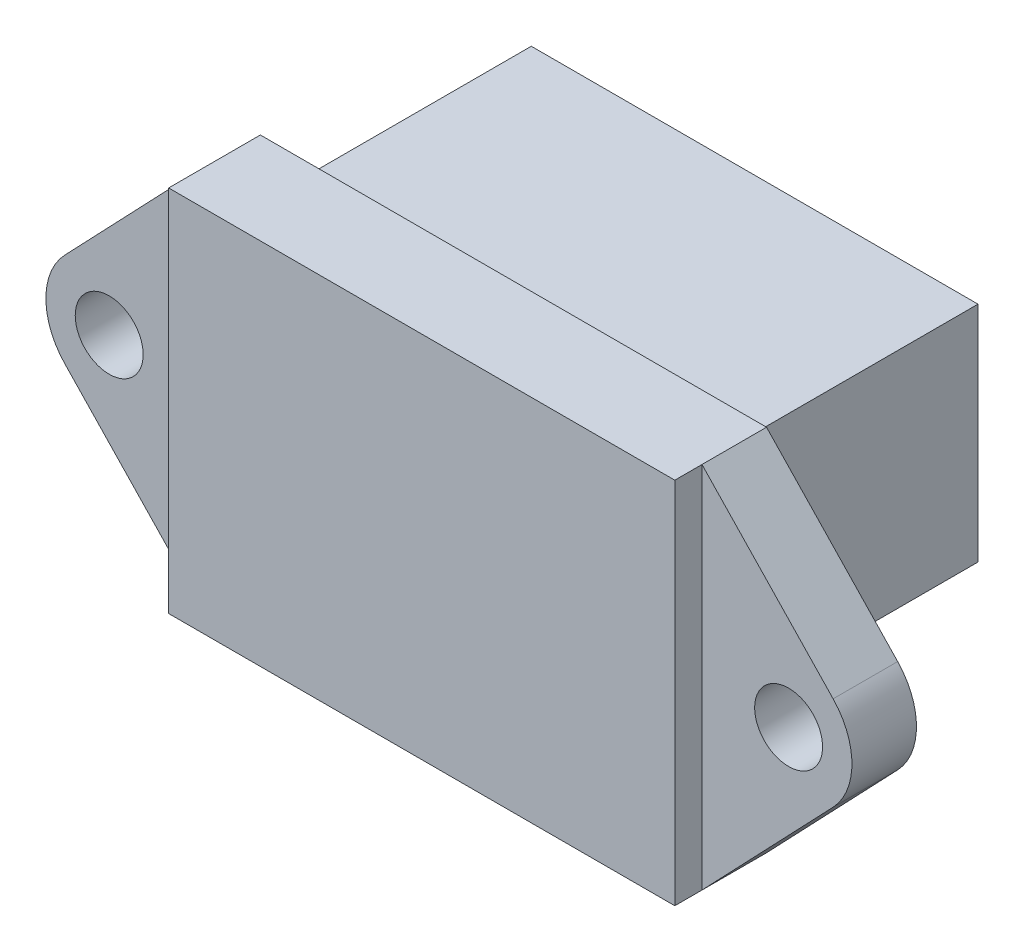
ISO-10303-21;
HEADER;
FILE_DESCRIPTION(('STEP AP214'),'2;1');
FILE_NAME('part.step','',(''),(''),'','','');
FILE_SCHEMA(('AUTOMOTIVE_DESIGN { 1 0 10303 214 1 1 1 1 }'));
ENDSEC;
DATA;
#1=APPLICATION_CONTEXT('core data for automotive mechanical design processes');
#2=APPLICATION_PROTOCOL_DEFINITION('international standard','automotive_design',2000,#1);
#3=PRODUCT_CONTEXT('',#1,'mechanical');
#4=PRODUCT('Part','Part','',(#3));
#5=PRODUCT_RELATED_PRODUCT_CATEGORY('part','',(#4));
#6=PRODUCT_DEFINITION_FORMATION('','',#4);
#7=PRODUCT_DEFINITION_CONTEXT('part definition',#1,'design');
#8=PRODUCT_DEFINITION('design','',#6,#7);
#9=PRODUCT_DEFINITION_SHAPE('','',#8);
#10=(LENGTH_UNIT() NAMED_UNIT(*) SI_UNIT(.MILLI.,.METRE.));
#11=(NAMED_UNIT(*) PLANE_ANGLE_UNIT() SI_UNIT($,.RADIAN.));
#12=(NAMED_UNIT(*) SI_UNIT($,.STERADIAN.) SOLID_ANGLE_UNIT());
#13=UNCERTAINTY_MEASURE_WITH_UNIT(LENGTH_MEASURE(1.E-05),#10,'distance_accuracy_value','');
#14=(GEOMETRIC_REPRESENTATION_CONTEXT(3) GLOBAL_UNCERTAINTY_ASSIGNED_CONTEXT((#13)) GLOBAL_UNIT_ASSIGNED_CONTEXT((#10,
#11,#12)) REPRESENTATION_CONTEXT('',''));
#15=CARTESIAN_POINT('',(0.,0.,0.));
#16=DIRECTION('',(0.,0.,1.));
#17=DIRECTION('',(1.,0.,0.));
#18=AXIS2_PLACEMENT_3D('',#15,#16,#17);
#19=CARTESIAN_POINT('',(-14.9,-10.85,5.4));
#20=DIRECTION('',(1.,0.,0.));
#21=DIRECTION('',(0.,0.,-1.));
#22=AXIS2_PLACEMENT_3D('',#19,#20,#21);
#23=PLANE('',#22);
#24=DIRECTION('',(0.,1.,0.));
#25=VECTOR('',#24,1.);
#26=CARTESIAN_POINT('',(-14.9,10.85,3.8));
#27=LINE('',#26,#25);
#28=CARTESIAN_POINT('',(-14.9,-10.85,3.8));
#29=VERTEX_POINT('',#28);
#30=CARTESIAN_POINT('',(-14.9,10.85,3.8));
#31=VERTEX_POINT('',#30);
#32=EDGE_CURVE('E198',#29,#31,#27,.T.);
#33=ORIENTED_EDGE('',*,*,#32,.F.);
#34=DIRECTION('',(0.,0.,-1.));
#35=VECTOR('',#34,1.);
#36=CARTESIAN_POINT('',(-14.9,-10.85,5.4));
#37=LINE('',#36,#35);
#38=CARTESIAN_POINT('',(-14.9,-10.85,5.4));
#39=VERTEX_POINT('',#38);
#40=EDGE_CURVE('E271',#39,#29,#37,.T.);
#41=ORIENTED_EDGE('',*,*,#40,.F.);
#42=DIRECTION('',(0.,-1.,0.));
#43=VECTOR('',#42,1.);
#44=CARTESIAN_POINT('',(-14.9,-10.85,5.4));
#45=LINE('',#44,#43);
#46=CARTESIAN_POINT('',(-14.9,10.85,5.4));
#47=VERTEX_POINT('',#46);
#48=EDGE_CURVE('E258',#47,#39,#45,.T.);
#49=ORIENTED_EDGE('',*,*,#48,.F.);
#50=DIRECTION('',(0.,0.,-1.));
#51=VECTOR('',#50,1.);
#52=CARTESIAN_POINT('',(-14.9,10.85,5.4));
#53=LINE('',#52,#51);
#54=EDGE_CURVE('E275',#47,#31,#53,.T.);
#55=ORIENTED_EDGE('',*,*,#54,.T.);
#56=EDGE_LOOP('',(#33,#41,#49,#55));
#57=FACE_BOUND('',#56,.T.);
#58=ADVANCED_FACE('F39',(#57),#23,.F.);
#59=CARTESIAN_POINT('',(14.9,-10.85,5.4));
#60=DIRECTION('',(-1.,0.,0.));
#61=DIRECTION('',(0.,0.,1.));
#62=AXIS2_PLACEMENT_3D('',#59,#60,#61);
#63=PLANE('',#62);
#64=DIRECTION('',(0.,-1.,0.));
#65=VECTOR('',#64,1.);
#66=CARTESIAN_POINT('',(14.9,10.85,3.8));
#67=LINE('',#66,#65);
#68=CARTESIAN_POINT('',(14.9,10.85,3.8));
#69=VERTEX_POINT('',#68);
#70=CARTESIAN_POINT('',(14.9,-10.85,3.8));
#71=VERTEX_POINT('',#70);
#72=EDGE_CURVE('E227',#69,#71,#67,.T.);
#73=ORIENTED_EDGE('',*,*,#72,.F.);
#74=DIRECTION('',(0.,0.,-1.));
#75=VECTOR('',#74,1.);
#76=CARTESIAN_POINT('',(14.9,10.85,5.4));
#77=LINE('',#76,#75);
#78=CARTESIAN_POINT('',(14.9,10.85,5.4));
#79=VERTEX_POINT('',#78);
#80=EDGE_CURVE('E278',#79,#69,#77,.T.);
#81=ORIENTED_EDGE('',*,*,#80,.F.);
#82=DIRECTION('',(0.,1.,0.));
#83=VECTOR('',#82,1.);
#84=CARTESIAN_POINT('',(14.9,-10.85,5.4));
#85=LINE('',#84,#83);
#86=CARTESIAN_POINT('',(14.9,-10.85,5.4));
#87=VERTEX_POINT('',#86);
#88=EDGE_CURVE('E250',#87,#79,#85,.T.);
#89=ORIENTED_EDGE('',*,*,#88,.F.);
#90=DIRECTION('',(0.,0.,-1.));
#91=VECTOR('',#90,1.);
#92=CARTESIAN_POINT('',(14.9,-10.85,5.4));
#93=LINE('',#92,#91);
#94=EDGE_CURVE('E264',#87,#71,#93,.T.);
#95=ORIENTED_EDGE('',*,*,#94,.T.);
#96=EDGE_LOOP('',(#73,#81,#89,#95));
#97=FACE_BOUND('',#96,.T.);
#98=ADVANCED_FACE('F359',(#97),#63,.F.);
#99=CARTESIAN_POINT('',(-14.9,10.85,5.4));
#100=DIRECTION('',(0.,-1.,0.));
#101=DIRECTION('',(0.,0.,-1.));
#102=AXIS2_PLACEMENT_3D('',#99,#100,#101);
#103=PLANE('',#102);
#104=DIRECTION('',(-1.,0.,0.));
#105=VECTOR('',#104,1.);
#106=CARTESIAN_POINT('',(-14.9,10.85,0.));
#107=LINE('',#106,#105);
#108=CARTESIAN_POINT('',(14.9,10.85,0.));
#109=VERTEX_POINT('',#108);
#110=CARTESIAN_POINT('',(-14.9,10.85,0.));
#111=VERTEX_POINT('',#110);
#112=EDGE_CURVE('E249',#109,#111,#107,.T.);
#113=ORIENTED_EDGE('',*,*,#112,.T.);
#114=DIRECTION('',(0.,0.,-1.));
#115=VECTOR('',#114,1.);
#116=CARTESIAN_POINT('',(-14.9,10.85,3.8));
#117=LINE('',#116,#115);
#118=EDGE_CURVE('E202',#31,#111,#117,.T.);
#119=ORIENTED_EDGE('',*,*,#118,.F.);
#120=ORIENTED_EDGE('',*,*,#54,.F.);
#121=DIRECTION('',(-1.,0.,0.));
#122=VECTOR('',#121,1.);
#123=CARTESIAN_POINT('',(-14.9,10.85,5.4));
#124=LINE('',#123,#122);
#125=EDGE_CURVE('E254',#79,#47,#124,.T.);
#126=ORIENTED_EDGE('',*,*,#125,.F.);
#127=ORIENTED_EDGE('',*,*,#80,.T.);
#128=DIRECTION('',(0.,0.,-1.));
#129=VECTOR('',#128,1.);
#130=CARTESIAN_POINT('',(14.9,10.85,3.8));
#131=LINE('',#130,#129);
#132=EDGE_CURVE('E245',#69,#109,#131,.T.);
#133=ORIENTED_EDGE('',*,*,#132,.T.);
#134=EDGE_LOOP('',(#113,#119,#120,#126,#127,#133));
#135=FACE_BOUND('',#134,.T.);
#136=ADVANCED_FACE('F327',(#135),#103,.F.);
#137=CARTESIAN_POINT('',(-14.9,-10.85,5.4));
#138=DIRECTION('',(0.,1.,0.));
#139=DIRECTION('',(0.,0.,1.));
#140=AXIS2_PLACEMENT_3D('',#137,#138,#139);
#141=PLANE('',#140);
#142=DIRECTION('',(1.,0.,0.));
#143=VECTOR('',#142,1.);
#144=CARTESIAN_POINT('',(-14.9,-10.85,0.));
#145=LINE('',#144,#143);
#146=CARTESIAN_POINT('',(-14.9,-10.85,0.));
#147=VERTEX_POINT('',#146);
#148=CARTESIAN_POINT('',(14.9,-10.85,0.));
#149=VERTEX_POINT('',#148);
#150=EDGE_CURVE('E255',#147,#149,#145,.T.);
#151=ORIENTED_EDGE('',*,*,#150,.T.);
#152=DIRECTION('',(0.,0.,-1.));
#153=VECTOR('',#152,1.);
#154=CARTESIAN_POINT('',(14.9,-10.85,3.8));
#155=LINE('',#154,#153);
#156=EDGE_CURVE('E236',#71,#149,#155,.T.);
#157=ORIENTED_EDGE('',*,*,#156,.F.);
#158=ORIENTED_EDGE('',*,*,#94,.F.);
#159=DIRECTION('',(1.,0.,0.));
#160=VECTOR('',#159,1.);
#161=CARTESIAN_POINT('',(-14.9,-10.85,5.4));
#162=LINE('',#161,#160);
#163=EDGE_CURVE('E261',#39,#87,#162,.T.);
#164=ORIENTED_EDGE('',*,*,#163,.F.);
#165=ORIENTED_EDGE('',*,*,#40,.T.);
#166=DIRECTION('',(0.,0.,-1.));
#167=VECTOR('',#166,1.);
#168=CARTESIAN_POINT('',(-14.9,-10.85,3.8));
#169=LINE('',#168,#167);
#170=EDGE_CURVE('E211',#29,#147,#169,.T.);
#171=ORIENTED_EDGE('',*,*,#170,.T.);
#172=EDGE_LOOP('',(#151,#157,#158,#164,#165,#171));
#173=FACE_BOUND('',#172,.T.);
#174=ADVANCED_FACE('F348',(#173),#141,.F.);
#175=CARTESIAN_POINT('',(0.,0.,5.4));
#176=DIRECTION('',(0.,0.,-1.));
#177=DIRECTION('',(-1.,0.,0.));
#178=AXIS2_PLACEMENT_3D('',#175,#176,#177);
#179=PLANE('',#178);
#180=ORIENTED_EDGE('',*,*,#88,.T.);
#181=ORIENTED_EDGE('',*,*,#125,.T.);
#182=ORIENTED_EDGE('',*,*,#48,.T.);
#183=ORIENTED_EDGE('',*,*,#163,.T.);
#184=EDGE_LOOP('',(#180,#181,#182,#183));
#185=FACE_BOUND('',#184,.T.);
#186=ADVANCED_FACE('F357',(#185),#179,.F.);
#187=CARTESIAN_POINT('',(0.,0.,0.));
#188=DIRECTION('',(0.,0.,-1.));
#189=DIRECTION('',(-1.,0.,0.));
#190=AXIS2_PLACEMENT_3D('',#187,#188,#189);
#191=PLANE('',#190);
#192=DIRECTION('',(0.,-1.,0.));
#193=VECTOR('',#192,1.);
#194=CARTESIAN_POINT('',(13.15,-4.00000000000001,0.));
#195=LINE('',#194,#193);
#196=CARTESIAN_POINT('',(13.15,9.15,0.));
#197=VERTEX_POINT('',#196);
#198=CARTESIAN_POINT('',(13.15,-4.00000000000001,0.));
#199=VERTEX_POINT('',#198);
#200=EDGE_CURVE('E55',#197,#199,#195,.T.);
#201=ORIENTED_EDGE('',*,*,#200,.F.);
#202=DIRECTION('',(1.,0.,0.));
#203=VECTOR('',#202,1.);
#204=CARTESIAN_POINT('',(13.15,9.15,0.));
#205=LINE('',#204,#203);
#206=CARTESIAN_POINT('',(-13.15,9.15,0.));
#207=VERTEX_POINT('',#206);
#208=EDGE_CURVE('E59',#207,#197,#205,.T.);
#209=ORIENTED_EDGE('',*,*,#208,.F.);
#210=DIRECTION('',(0.,1.,0.));
#211=VECTOR('',#210,1.);
#212=CARTESIAN_POINT('',(-13.15,9.15,0.));
#213=LINE('',#212,#211);
#214=CARTESIAN_POINT('',(-13.15,-4.00000000000001,0.));
#215=VERTEX_POINT('',#214);
#216=EDGE_CURVE('E529',#215,#207,#213,.T.);
#217=ORIENTED_EDGE('',*,*,#216,.F.);
#218=DIRECTION('',(-0.707106781186548,0.707106781186547,0.));
#219=VECTOR('',#218,1.);
#220=CARTESIAN_POINT('',(-13.15,-4.00000000000001,0.));
#221=LINE('',#220,#219);
#222=CARTESIAN_POINT('',(-8.,-9.15000000000001,0.));
#223=VERTEX_POINT('',#222);
#224=EDGE_CURVE('E549',#223,#215,#221,.T.);
#225=ORIENTED_EDGE('',*,*,#224,.F.);
#226=DIRECTION('',(-1.,0.,0.));
#227=VECTOR('',#226,1.);
#228=CARTESIAN_POINT('',(-8.,-9.15000000000001,0.));
#229=LINE('',#228,#227);
#230=CARTESIAN_POINT('',(8.,-9.15000000000001,0.));
#231=VERTEX_POINT('',#230);
#232=EDGE_CURVE('E552',#231,#223,#229,.T.);
#233=ORIENTED_EDGE('',*,*,#232,.F.);
#234=DIRECTION('',(-0.707106781186548,-0.707106781186547,0.));
#235=VECTOR('',#234,1.);
#236=CARTESIAN_POINT('',(8.,-9.15000000000001,0.));
#237=LINE('',#236,#235);
#238=EDGE_CURVE('E554',#199,#231,#237,.T.);
#239=ORIENTED_EDGE('',*,*,#238,.F.);
#240=EDGE_LOOP('',(#201,#209,#217,#225,#233,#239));
#241=FACE_BOUND('',#240,.T.);
#242=DIRECTION('',(0.690499014401099,-0.723333333333333,0.));
#243=VECTOR('',#242,1.);
#244=CARTESIAN_POINT('',(-14.9,-10.85,0.));
#245=LINE('',#244,#243);
#246=CARTESIAN_POINT('',(-22.6208646322991,-2.7619960576044,0.));
#247=VERTEX_POINT('',#246);
#248=EDGE_CURVE('E195',#247,#147,#245,.T.);
#249=ORIENTED_EDGE('',*,*,#248,.F.);
#250=CARTESIAN_POINT('',(-19.7275312989658,0.,0.));
#251=DIRECTION('',(0.,0.,-1.));
#252=DIRECTION('',(-1.,0.,0.));
#253=AXIS2_PLACEMENT_3D('',#250,#251,#252);
#254=CIRCLE('',#253,4.);
#255=CARTESIAN_POINT('',(-22.6208646322991,2.76199605760439,0.));
#256=VERTEX_POINT('',#255);
#257=EDGE_CURVE('E289',#247,#256,#254,.T.);
#258=ORIENTED_EDGE('',*,*,#257,.T.);
#259=DIRECTION('',(-0.690499014401099,-0.723333333333333,0.));
#260=VECTOR('',#259,1.);
#261=CARTESIAN_POINT('',(-25.2574852160165,0.,0.));
#262=LINE('',#261,#260);
#263=EDGE_CURVE('E188',#111,#256,#262,.T.);
#264=ORIENTED_EDGE('',*,*,#263,.F.);
#265=ORIENTED_EDGE('',*,*,#112,.F.);
#266=DIRECTION('',(-0.690499014401099,0.723333333333333,0.));
#267=VECTOR('',#266,1.);
#268=CARTESIAN_POINT('',(25.2574852160165,0.,0.));
#269=LINE('',#268,#267);
#270=CARTESIAN_POINT('',(22.6208646322991,2.76199605760439,0.));
#271=VERTEX_POINT('',#270);
#272=EDGE_CURVE('E220',#271,#109,#269,.T.);
#273=ORIENTED_EDGE('',*,*,#272,.F.);
#274=CARTESIAN_POINT('',(19.7275312989658,0.,0.));
#275=DIRECTION('',(0.,0.,-1.));
#276=DIRECTION('',(-1.,0.,0.));
#277=AXIS2_PLACEMENT_3D('',#274,#275,#276);
#278=CIRCLE('',#277,4.);
#279=CARTESIAN_POINT('',(22.6208646322991,-2.7619960576044,0.));
#280=VERTEX_POINT('',#279);
#281=EDGE_CURVE('E286',#271,#280,#278,.T.);
#282=ORIENTED_EDGE('',*,*,#281,.T.);
#283=DIRECTION('',(0.690499014401099,0.723333333333333,0.));
#284=VECTOR('',#283,1.);
#285=CARTESIAN_POINT('',(14.9,-10.85,0.));
#286=LINE('',#285,#284);
#287=EDGE_CURVE('E228',#149,#280,#286,.T.);
#288=ORIENTED_EDGE('',*,*,#287,.F.);
#289=ORIENTED_EDGE('',*,*,#150,.F.);
#290=EDGE_LOOP('',(#249,#258,#264,#265,#273,#282,#288,#289));
#291=FACE_BOUND('',#290,.T.);
#292=CARTESIAN_POINT('',(20.,0.,0.));
#293=DIRECTION('',(0.,0.,1.));
#294=DIRECTION('',(1.,0.,0.));
#295=AXIS2_PLACEMENT_3D('',#292,#293,#294);
#296=CIRCLE('',#295,2.);
#297=CARTESIAN_POINT('',(18.,0.,0.));
#298=VERTEX_POINT('',#297);
#299=EDGE_CURVE('E215',#298,#298,#296,.T.);
#300=ORIENTED_EDGE('',*,*,#299,.T.);
#301=EDGE_LOOP('',(#300));
#302=FACE_BOUND('',#301,.T.);
#303=CARTESIAN_POINT('',(-20.,0.,0.));
#304=DIRECTION('',(0.,0.,1.));
#305=DIRECTION('',(1.,0.,0.));
#306=AXIS2_PLACEMENT_3D('',#303,#304,#305);
#307=CIRCLE('',#306,2.);
#308=CARTESIAN_POINT('',(-22.,0.,0.));
#309=VERTEX_POINT('',#308);
#310=EDGE_CURVE('E175',#309,#309,#307,.T.);
#311=ORIENTED_EDGE('',*,*,#310,.T.);
#312=EDGE_LOOP('',(#311));
#313=FACE_BOUND('',#312,.T.);
#314=ADVANCED_FACE('F322',(#241,#291,#302,#313),#191,.T.);
#315=CARTESIAN_POINT('',(0.,0.,3.8));
#316=DIRECTION('',(0.,0.,-1.));
#317=DIRECTION('',(-1.,0.,0.));
#318=AXIS2_PLACEMENT_3D('',#315,#316,#317);
#319=PLANE('',#318);
#320=DIRECTION('',(0.690499014401099,0.723333333333333,0.));
#321=VECTOR('',#320,1.);
#322=CARTESIAN_POINT('',(14.9,-10.85,3.8));
#323=LINE('',#322,#321);
#324=CARTESIAN_POINT('',(22.6208646322991,-2.7619960576044,3.8));
#325=VERTEX_POINT('',#324);
#326=EDGE_CURVE('E232',#71,#325,#323,.T.);
#327=ORIENTED_EDGE('',*,*,#326,.T.);
#328=CARTESIAN_POINT('',(19.7275312989658,0.,3.8));
#329=DIRECTION('',(0.,0.,-1.));
#330=DIRECTION('',(-1.,0.,0.));
#331=AXIS2_PLACEMENT_3D('',#328,#329,#330);
#332=CIRCLE('',#331,4.);
#333=CARTESIAN_POINT('',(22.6208646322991,2.76199605760439,3.8));
#334=VERTEX_POINT('',#333);
#335=EDGE_CURVE('E11',#325,#334,#332,.F.);
#336=ORIENTED_EDGE('',*,*,#335,.T.);
#337=DIRECTION('',(-0.690499014401099,0.723333333333333,0.));
#338=VECTOR('',#337,1.);
#339=CARTESIAN_POINT('',(25.2574852160165,0.,3.8));
#340=LINE('',#339,#338);
#341=EDGE_CURVE('E224',#334,#69,#340,.T.);
#342=ORIENTED_EDGE('',*,*,#341,.T.);
#343=ORIENTED_EDGE('',*,*,#72,.T.);
#344=EDGE_LOOP('',(#327,#336,#342,#343));
#345=FACE_BOUND('',#344,.T.);
#346=CARTESIAN_POINT('',(20.,0.,3.8));
#347=DIRECTION('',(0.,0.,1.));
#348=DIRECTION('',(1.,0.,0.));
#349=AXIS2_PLACEMENT_3D('',#346,#347,#348);
#350=CIRCLE('',#349,2.);
#351=CARTESIAN_POINT('',(18.,0.,3.8));
#352=VERTEX_POINT('',#351);
#353=EDGE_CURVE('E216',#352,#352,#350,.T.);
#354=ORIENTED_EDGE('',*,*,#353,.F.);
#355=EDGE_LOOP('',(#354));
#356=FACE_BOUND('',#355,.T.);
#357=ADVANCED_FACE('F310',(#345,#356),#319,.F.);
#358=CARTESIAN_POINT('',(25.2574852160165,0.,3.8));
#359=DIRECTION('',(-0.723333333333333,-0.690499014401099,0.));
#360=DIRECTION('',(0.690499014401099,-0.723333333333333,0.));
#361=AXIS2_PLACEMENT_3D('',#358,#359,#360);
#362=PLANE('',#361);
#363=ORIENTED_EDGE('',*,*,#341,.F.);
#364=DIRECTION('',(0.,0.,-1.));
#365=VECTOR('',#364,1.);
#366=CARTESIAN_POINT('',(22.6208646322991,2.76199605760439,3.8));
#367=LINE('',#366,#365);
#368=EDGE_CURVE('E298',#334,#271,#367,.T.);
#369=ORIENTED_EDGE('',*,*,#368,.T.);
#370=ORIENTED_EDGE('',*,*,#272,.T.);
#371=ORIENTED_EDGE('',*,*,#132,.F.);
#372=EDGE_LOOP('',(#363,#369,#370,#371));
#373=FACE_BOUND('',#372,.T.);
#374=ADVANCED_FACE('F317',(#373),#362,.F.);
#375=CARTESIAN_POINT('',(14.9,-10.85,3.8));
#376=DIRECTION('',(-0.723333333333333,0.690499014401099,0.));
#377=DIRECTION('',(-0.690499014401099,-0.723333333333333,0.));
#378=AXIS2_PLACEMENT_3D('',#375,#376,#377);
#379=PLANE('',#378);
#380=ORIENTED_EDGE('',*,*,#287,.T.);
#381=DIRECTION('',(0.,0.,-1.));
#382=VECTOR('',#381,1.);
#383=CARTESIAN_POINT('',(22.6208646322991,-2.7619960576044,3.8));
#384=LINE('',#383,#382);
#385=EDGE_CURVE('E48',#280,#325,#384,.F.);
#386=ORIENTED_EDGE('',*,*,#385,.T.);
#387=ORIENTED_EDGE('',*,*,#326,.F.);
#388=ORIENTED_EDGE('',*,*,#156,.T.);
#389=EDGE_LOOP('',(#380,#386,#387,#388));
#390=FACE_BOUND('',#389,.T.);
#391=ADVANCED_FACE('F305',(#390),#379,.F.);
#392=CARTESIAN_POINT('',(20.,0.,3.8));
#393=DIRECTION('',(0.,0.,-1.));
#394=DIRECTION('',(-1.,0.,0.));
#395=AXIS2_PLACEMENT_3D('',#392,#393,#394);
#396=CYLINDRICAL_SURFACE('',#395,2.);
#397=CARTESIAN_POINT('',(18.,0.,3.8));
#398=CARTESIAN_POINT('',(18.,0.,3.76041666666667));
#399=CARTESIAN_POINT('',(18.,0.,3.72083333333333));
#400=CARTESIAN_POINT('',(18.,0.,3.64166666666667));
#401=CARTESIAN_POINT('',(18.,0.,3.60208333333333));
#402=CARTESIAN_POINT('',(18.,0.,3.52291666666667));
#403=CARTESIAN_POINT('',(18.,0.,3.48333333333333));
#404=CARTESIAN_POINT('',(18.,0.,3.40416666666667));
#405=CARTESIAN_POINT('',(18.,0.,3.36458333333333));
#406=CARTESIAN_POINT('',(18.,0.,3.28541666666667));
#407=CARTESIAN_POINT('',(18.,0.,3.24583333333333));
#408=CARTESIAN_POINT('',(18.,0.,3.16666666666667));
#409=CARTESIAN_POINT('',(18.,0.,3.12708333333333));
#410=CARTESIAN_POINT('',(18.,0.,3.04791666666667));
#411=CARTESIAN_POINT('',(18.,0.,3.00833333333333));
#412=CARTESIAN_POINT('',(18.,0.,2.92916666666667));
#413=CARTESIAN_POINT('',(18.,0.,2.88958333333333));
#414=CARTESIAN_POINT('',(18.,0.,2.81041666666667));
#415=CARTESIAN_POINT('',(18.,0.,2.77083333333333));
#416=CARTESIAN_POINT('',(18.,0.,2.69166666666667));
#417=CARTESIAN_POINT('',(18.,0.,2.65208333333333));
#418=CARTESIAN_POINT('',(18.,0.,2.57291666666667));
#419=CARTESIAN_POINT('',(18.,0.,2.53333333333333));
#420=CARTESIAN_POINT('',(18.,0.,2.45416666666667));
#421=CARTESIAN_POINT('',(18.,0.,2.41458333333333));
#422=CARTESIAN_POINT('',(18.,0.,2.33541666666667));
#423=CARTESIAN_POINT('',(18.,0.,2.29583333333333));
#424=CARTESIAN_POINT('',(18.,0.,2.21666666666667));
#425=CARTESIAN_POINT('',(18.,0.,2.17708333333333));
#426=CARTESIAN_POINT('',(18.,0.,2.09791666666667));
#427=CARTESIAN_POINT('',(18.,0.,2.05833333333333));
#428=CARTESIAN_POINT('',(18.,0.,1.97916666666667));
#429=CARTESIAN_POINT('',(18.,0.,1.93958333333333));
#430=CARTESIAN_POINT('',(18.,0.,1.86041666666667));
#431=CARTESIAN_POINT('',(18.,0.,1.82083333333333));
#432=CARTESIAN_POINT('',(18.,0.,1.74166666666667));
#433=CARTESIAN_POINT('',(18.,0.,1.70208333333333));
#434=CARTESIAN_POINT('',(18.,0.,1.62291666666667));
#435=CARTESIAN_POINT('',(18.,0.,1.58333333333333));
#436=CARTESIAN_POINT('',(18.,0.,1.50416666666667));
#437=CARTESIAN_POINT('',(18.,0.,1.46458333333333));
#438=CARTESIAN_POINT('',(18.,0.,1.38541666666667));
#439=CARTESIAN_POINT('',(18.,0.,1.34583333333333));
#440=CARTESIAN_POINT('',(18.,0.,1.26666666666667));
#441=CARTESIAN_POINT('',(18.,0.,1.22708333333333));
#442=CARTESIAN_POINT('',(18.,0.,1.14791666666667));
#443=CARTESIAN_POINT('',(18.,0.,1.10833333333333));
#444=CARTESIAN_POINT('',(18.,0.,1.02916666666667));
#445=CARTESIAN_POINT('',(18.,0.,0.989583333333334));
#446=CARTESIAN_POINT('',(18.,0.,0.910416666666667));
#447=CARTESIAN_POINT('',(18.,0.,0.870833333333333));
#448=CARTESIAN_POINT('',(18.,0.,0.791666666666667));
#449=CARTESIAN_POINT('',(18.,0.,0.752083333333333));
#450=CARTESIAN_POINT('',(18.,0.,0.672916666666667));
#451=CARTESIAN_POINT('',(18.,0.,0.633333333333333));
#452=CARTESIAN_POINT('',(18.,0.,0.554166666666667));
#453=CARTESIAN_POINT('',(18.,0.,0.514583333333334));
#454=CARTESIAN_POINT('',(18.,0.,0.435416666666667));
#455=CARTESIAN_POINT('',(18.,0.,0.395833333333334));
#456=CARTESIAN_POINT('',(18.,0.,0.316666666666667));
#457=CARTESIAN_POINT('',(18.,0.,0.277083333333333));
#458=CARTESIAN_POINT('',(18.,0.,0.197916666666667));
#459=CARTESIAN_POINT('',(18.,0.,0.158333333333333));
#460=CARTESIAN_POINT('',(18.,0.,0.0791666666666666));
#461=CARTESIAN_POINT('',(18.,0.,0.0395833333333333));
#462=CARTESIAN_POINT('',(18.,0.,0.));
#463=B_SPLINE_CURVE_WITH_KNOTS('',3,(#397,#398,#399,#400,#401,#402,#403,#404,#405,#406,#407,
#408,#409,#410,#411,#412,#413,#414,#415,#416,#417,#418,#419,#420,#421,#422,#423,#424,#425,#426,
#427,#428,#429,#430,#431,#432,#433,#434,#435,#436,#437,#438,#439,#440,#441,#442,#443,#444,#445,
#446,#447,#448,#449,#450,#451,#452,#453,#454,#455,#456,#457,#458,#459,#460,#461,#462),
.UNSPECIFIED.,.F.,.F.,(4,2,2,2,2,2,2,2,2,2,2,2,2,2,2,2,2,2,2,2,2,2,2,2,2,2,2,2,2,2,2,2,4),(0.,
0.11875,0.2375,0.35625,0.475,0.59375,0.7125,0.83125,0.95,1.06875,1.1875,1.30625,1.425,1.54375,
1.6625,1.78125,1.9,2.01875,2.1375,2.25625,2.375,2.49375,2.6125,2.73125,2.85,2.96875,3.0875,
3.20625,3.325,3.44375,3.5625,3.68125,3.8),.UNSPECIFIED.);
#464=EDGE_CURVE('BSEAM385',#352,#298,#463,.T.);
#465=ORIENTED_EDGE('',*,*,#353,.T.);
#466=ORIENTED_EDGE('',*,*,#299,.F.);
#467=ORIENTED_EDGE('',*,*,#464,.T.);
#468=ORIENTED_EDGE('',*,*,#464,.F.);
#469=EDGE_LOOP('',(#465,#467,#466,#468));
#470=FACE_BOUND('',#469,.T.);
#471=ADVANCED_FACE('F385',(#470),#396,.F.);
#472=CARTESIAN_POINT('',(0.,0.,3.8));
#473=DIRECTION('',(0.,0.,1.));
#474=DIRECTION('',(1.,0.,0.));
#475=AXIS2_PLACEMENT_3D('',#472,#473,#474);
#476=PLANE('',#475);
#477=DIRECTION('',(-0.690499014401099,-0.723333333333333,0.));
#478=VECTOR('',#477,1.);
#479=CARTESIAN_POINT('',(-25.2574852160165,0.,3.8));
#480=LINE('',#479,#478);
#481=CARTESIAN_POINT('',(-22.6208646322991,2.76199605760439,3.8));
#482=VERTEX_POINT('',#481);
#483=EDGE_CURVE('E190',#31,#482,#480,.T.);
#484=ORIENTED_EDGE('',*,*,#483,.T.);
#485=CARTESIAN_POINT('',(-19.7275312989658,0.,3.8));
#486=DIRECTION('',(0.,0.,1.));
#487=DIRECTION('',(1.,0.,0.));
#488=AXIS2_PLACEMENT_3D('',#485,#486,#487);
#489=CIRCLE('',#488,4.);
#490=CARTESIAN_POINT('',(-22.6208646322991,-2.7619960576044,3.8));
#491=VERTEX_POINT('',#490);
#492=EDGE_CURVE('E295',#482,#491,#489,.T.);
#493=ORIENTED_EDGE('',*,*,#492,.T.);
#494=DIRECTION('',(0.690499014401099,-0.723333333333333,0.));
#495=VECTOR('',#494,1.);
#496=CARTESIAN_POINT('',(-14.9,-10.85,3.8));
#497=LINE('',#496,#495);
#498=EDGE_CURVE('E194',#491,#29,#497,.T.);
#499=ORIENTED_EDGE('',*,*,#498,.T.);
#500=ORIENTED_EDGE('',*,*,#32,.T.);
#501=EDGE_LOOP('',(#484,#493,#499,#500));
#502=FACE_BOUND('',#501,.T.);
#503=CARTESIAN_POINT('',(-20.,0.,3.8));
#504=DIRECTION('',(0.,0.,1.));
#505=DIRECTION('',(1.,0.,0.));
#506=AXIS2_PLACEMENT_3D('',#503,#504,#505);
#507=CIRCLE('',#506,2.);
#508=CARTESIAN_POINT('',(-22.,0.,3.8));
#509=VERTEX_POINT('',#508);
#510=EDGE_CURVE('E180',#509,#509,#507,.T.);
#511=ORIENTED_EDGE('',*,*,#510,.F.);
#512=EDGE_LOOP('',(#511));
#513=FACE_BOUND('',#512,.T.);
#514=ADVANCED_FACE('F335',(#502,#513),#476,.T.);
#515=CARTESIAN_POINT('',(-25.2574852160165,0.,3.8));
#516=DIRECTION('',(0.723333333333333,-0.690499014401099,0.));
#517=DIRECTION('',(0.690499014401099,0.723333333333333,0.));
#518=AXIS2_PLACEMENT_3D('',#515,#516,#517);
#519=PLANE('',#518);
#520=ORIENTED_EDGE('',*,*,#263,.T.);
#521=DIRECTION('',(0.,0.,-1.));
#522=VECTOR('',#521,1.);
#523=CARTESIAN_POINT('',(-22.6208646322991,2.76199605760439,3.8));
#524=LINE('',#523,#522);
#525=EDGE_CURVE('E292',#256,#482,#524,.F.);
#526=ORIENTED_EDGE('',*,*,#525,.T.);
#527=ORIENTED_EDGE('',*,*,#483,.F.);
#528=ORIENTED_EDGE('',*,*,#118,.T.);
#529=EDGE_LOOP('',(#520,#526,#527,#528));
#530=FACE_BOUND('',#529,.T.);
#531=ADVANCED_FACE('F331',(#530),#519,.F.);
#532=CARTESIAN_POINT('',(-14.9,-10.85,3.8));
#533=DIRECTION('',(0.723333333333333,0.690499014401099,0.));
#534=DIRECTION('',(-0.690499014401099,0.723333333333333,0.));
#535=AXIS2_PLACEMENT_3D('',#532,#533,#534);
#536=PLANE('',#535);
#537=ORIENTED_EDGE('',*,*,#498,.F.);
#538=DIRECTION('',(0.,0.,-1.));
#539=VECTOR('',#538,1.);
#540=CARTESIAN_POINT('',(-22.6208646322991,-2.7619960576044,3.8));
#541=LINE('',#540,#539);
#542=EDGE_CURVE('E282',#491,#247,#541,.T.);
#543=ORIENTED_EDGE('',*,*,#542,.T.);
#544=ORIENTED_EDGE('',*,*,#248,.T.);
#545=ORIENTED_EDGE('',*,*,#170,.F.);
#546=EDGE_LOOP('',(#537,#543,#544,#545));
#547=FACE_BOUND('',#546,.T.);
#548=ADVANCED_FACE('F343',(#547),#536,.F.);
#549=CARTESIAN_POINT('',(-20.,0.,3.8));
#550=DIRECTION('',(0.,0.,-1.));
#551=DIRECTION('',(-1.,0.,0.));
#552=AXIS2_PLACEMENT_3D('',#549,#550,#551);
#553=CYLINDRICAL_SURFACE('',#552,2.);
#554=CARTESIAN_POINT('',(-22.,0.,3.8));
#555=CARTESIAN_POINT('',(-22.,0.,3.76041666666667));
#556=CARTESIAN_POINT('',(-22.,0.,3.72083333333333));
#557=CARTESIAN_POINT('',(-22.,0.,3.64166666666667));
#558=CARTESIAN_POINT('',(-22.,0.,3.60208333333333));
#559=CARTESIAN_POINT('',(-22.,0.,3.52291666666667));
#560=CARTESIAN_POINT('',(-22.,0.,3.48333333333333));
#561=CARTESIAN_POINT('',(-22.,0.,3.40416666666667));
#562=CARTESIAN_POINT('',(-22.,0.,3.36458333333333));
#563=CARTESIAN_POINT('',(-22.,0.,3.28541666666667));
#564=CARTESIAN_POINT('',(-22.,0.,3.24583333333333));
#565=CARTESIAN_POINT('',(-22.,0.,3.16666666666667));
#566=CARTESIAN_POINT('',(-22.,0.,3.12708333333333));
#567=CARTESIAN_POINT('',(-22.,0.,3.04791666666667));
#568=CARTESIAN_POINT('',(-22.,0.,3.00833333333333));
#569=CARTESIAN_POINT('',(-22.,0.,2.92916666666667));
#570=CARTESIAN_POINT('',(-22.,0.,2.88958333333333));
#571=CARTESIAN_POINT('',(-22.,0.,2.81041666666667));
#572=CARTESIAN_POINT('',(-22.,0.,2.77083333333333));
#573=CARTESIAN_POINT('',(-22.,0.,2.69166666666667));
#574=CARTESIAN_POINT('',(-22.,0.,2.65208333333333));
#575=CARTESIAN_POINT('',(-22.,0.,2.57291666666667));
#576=CARTESIAN_POINT('',(-22.,0.,2.53333333333333));
#577=CARTESIAN_POINT('',(-22.,0.,2.45416666666667));
#578=CARTESIAN_POINT('',(-22.,0.,2.41458333333333));
#579=CARTESIAN_POINT('',(-22.,0.,2.33541666666667));
#580=CARTESIAN_POINT('',(-22.,0.,2.29583333333333));
#581=CARTESIAN_POINT('',(-22.,0.,2.21666666666667));
#582=CARTESIAN_POINT('',(-22.,0.,2.17708333333333));
#583=CARTESIAN_POINT('',(-22.,0.,2.09791666666667));
#584=CARTESIAN_POINT('',(-22.,0.,2.05833333333333));
#585=CARTESIAN_POINT('',(-22.,0.,1.97916666666667));
#586=CARTESIAN_POINT('',(-22.,0.,1.93958333333333));
#587=CARTESIAN_POINT('',(-22.,0.,1.86041666666667));
#588=CARTESIAN_POINT('',(-22.,0.,1.82083333333333));
#589=CARTESIAN_POINT('',(-22.,0.,1.74166666666667));
#590=CARTESIAN_POINT('',(-22.,0.,1.70208333333333));
#591=CARTESIAN_POINT('',(-22.,0.,1.62291666666667));
#592=CARTESIAN_POINT('',(-22.,0.,1.58333333333333));
#593=CARTESIAN_POINT('',(-22.,0.,1.50416666666667));
#594=CARTESIAN_POINT('',(-22.,0.,1.46458333333333));
#595=CARTESIAN_POINT('',(-22.,0.,1.38541666666667));
#596=CARTESIAN_POINT('',(-22.,0.,1.34583333333333));
#597=CARTESIAN_POINT('',(-22.,0.,1.26666666666667));
#598=CARTESIAN_POINT('',(-22.,0.,1.22708333333333));
#599=CARTESIAN_POINT('',(-22.,0.,1.14791666666667));
#600=CARTESIAN_POINT('',(-22.,0.,1.10833333333333));
#601=CARTESIAN_POINT('',(-22.,0.,1.02916666666667));
#602=CARTESIAN_POINT('',(-22.,0.,0.989583333333334));
#603=CARTESIAN_POINT('',(-22.,0.,0.910416666666667));
#604=CARTESIAN_POINT('',(-22.,0.,0.870833333333333));
#605=CARTESIAN_POINT('',(-22.,0.,0.791666666666667));
#606=CARTESIAN_POINT('',(-22.,0.,0.752083333333333));
#607=CARTESIAN_POINT('',(-22.,0.,0.672916666666667));
#608=CARTESIAN_POINT('',(-22.,0.,0.633333333333333));
#609=CARTESIAN_POINT('',(-22.,0.,0.554166666666667));
#610=CARTESIAN_POINT('',(-22.,0.,0.514583333333334));
#611=CARTESIAN_POINT('',(-22.,0.,0.435416666666667));
#612=CARTESIAN_POINT('',(-22.,0.,0.395833333333334));
#613=CARTESIAN_POINT('',(-22.,0.,0.316666666666667));
#614=CARTESIAN_POINT('',(-22.,0.,0.277083333333333));
#615=CARTESIAN_POINT('',(-22.,0.,0.197916666666667));
#616=CARTESIAN_POINT('',(-22.,0.,0.158333333333333));
#617=CARTESIAN_POINT('',(-22.,0.,0.0791666666666666));
#618=CARTESIAN_POINT('',(-22.,0.,0.0395833333333333));
#619=CARTESIAN_POINT('',(-22.,0.,0.));
#620=B_SPLINE_CURVE_WITH_KNOTS('',3,(#554,#555,#556,#557,#558,#559,#560,#561,#562,#563,#564,
#565,#566,#567,#568,#569,#570,#571,#572,#573,#574,#575,#576,#577,#578,#579,#580,#581,#582,#583,
#584,#585,#586,#587,#588,#589,#590,#591,#592,#593,#594,#595,#596,#597,#598,#599,#600,#601,#602,
#603,#604,#605,#606,#607,#608,#609,#610,#611,#612,#613,#614,#615,#616,#617,#618,#619),
.UNSPECIFIED.,.F.,.F.,(4,2,2,2,2,2,2,2,2,2,2,2,2,2,2,2,2,2,2,2,2,2,2,2,2,2,2,2,2,2,2,2,4),(0.,
0.11875,0.2375,0.35625,0.475,0.59375,0.7125,0.83125,0.95,1.06875,1.1875,1.30625,1.425,1.54375,
1.6625,1.78125,1.9,2.01875,2.1375,2.25625,2.375,2.49375,2.6125,2.73125,2.85,2.96875,3.0875,
3.20625,3.325,3.44375,3.5625,3.68125,3.8),.UNSPECIFIED.);
#621=EDGE_CURVE('BSEAM369',#509,#309,#620,.T.);
#622=ORIENTED_EDGE('',*,*,#510,.T.);
#623=ORIENTED_EDGE('',*,*,#310,.F.);
#624=ORIENTED_EDGE('',*,*,#621,.T.);
#625=ORIENTED_EDGE('',*,*,#621,.F.);
#626=EDGE_LOOP('',(#622,#624,#623,#625));
#627=FACE_BOUND('',#626,.T.);
#628=ADVANCED_FACE('F369',(#627),#553,.F.);
#629=CARTESIAN_POINT('',(-19.7275312989658,0.,3.8));
#630=DIRECTION('',(0.,0.,-1.));
#631=DIRECTION('',(-1.,0.,0.));
#632=AXIS2_PLACEMENT_3D('',#629,#630,#631);
#633=CYLINDRICAL_SURFACE('',#632,4.);
#634=ORIENTED_EDGE('',*,*,#492,.F.);
#635=ORIENTED_EDGE('',*,*,#525,.F.);
#636=ORIENTED_EDGE('',*,*,#257,.F.);
#637=ORIENTED_EDGE('',*,*,#542,.F.);
#638=EDGE_LOOP('',(#634,#635,#636,#637));
#639=FACE_BOUND('',#638,.T.);
#640=ADVANCED_FACE('F341',(#639),#633,.T.);
#641=CARTESIAN_POINT('',(19.7275312989658,0.,3.8));
#642=DIRECTION('',(0.,0.,-1.));
#643=DIRECTION('',(-1.,0.,0.));
#644=AXIS2_PLACEMENT_3D('',#641,#642,#643);
#645=CYLINDRICAL_SURFACE('',#644,4.);
#646=ORIENTED_EDGE('',*,*,#335,.F.);
#647=ORIENTED_EDGE('',*,*,#385,.F.);
#648=ORIENTED_EDGE('',*,*,#281,.F.);
#649=ORIENTED_EDGE('',*,*,#368,.F.);
#650=EDGE_LOOP('',(#646,#647,#648,#649));
#651=FACE_BOUND('',#650,.T.);
#652=ADVANCED_FACE('F41',(#651),#645,.T.);
#653=CARTESIAN_POINT('',(13.15,-4.00000000000001,-14.2));
#654=DIRECTION('',(-1.,0.,0.));
#655=DIRECTION('',(0.,0.,1.));
#656=AXIS2_PLACEMENT_3D('',#653,#654,#655);
#657=PLANE('',#656);
#658=ORIENTED_EDGE('',*,*,#200,.T.);
#659=DIRECTION('',(0.,0.,1.));
#660=VECTOR('',#659,1.);
#661=CARTESIAN_POINT('',(13.15,-4.00000000000001,-14.2));
#662=LINE('',#661,#660);
#663=CARTESIAN_POINT('',(13.15,-4.00000000000001,-14.2));
#664=VERTEX_POINT('',#663);
#665=EDGE_CURVE('E155',#664,#199,#662,.T.);
#666=ORIENTED_EDGE('',*,*,#665,.F.);
#667=DIRECTION('',(0.,-1.,0.));
#668=VECTOR('',#667,1.);
#669=CARTESIAN_POINT('',(13.15,-4.00000000000001,-14.2));
#670=LINE('',#669,#668);
#671=CARTESIAN_POINT('',(13.15,9.15,-14.2));
#672=VERTEX_POINT('',#671);
#673=EDGE_CURVE('E162',#672,#664,#670,.T.);
#674=ORIENTED_EDGE('',*,*,#673,.F.);
#675=DIRECTION('',(0.,0.,1.));
#676=VECTOR('',#675,1.);
#677=CARTESIAN_POINT('',(13.15,9.15,-14.2));
#678=LINE('',#677,#676);
#679=EDGE_CURVE('E525',#672,#197,#678,.T.);
#680=ORIENTED_EDGE('',*,*,#679,.T.);
#681=EDGE_LOOP('',(#658,#666,#674,#680));
#682=FACE_BOUND('',#681,.T.);
#683=ADVANCED_FACE('F173',(#682),#657,.F.);
#684=CARTESIAN_POINT('',(8.,-9.15000000000001,-14.2));
#685=DIRECTION('',(-0.707106781186547,0.707106781186548,0.));
#686=DIRECTION('',(-0.707106781186548,-0.707106781186547,0.));
#687=AXIS2_PLACEMENT_3D('',#684,#685,#686);
#688=PLANE('',#687);
#689=ORIENTED_EDGE('',*,*,#238,.T.);
#690=DIRECTION('',(0.,0.,1.));
#691=VECTOR('',#690,1.);
#692=CARTESIAN_POINT('',(8.,-9.15000000000001,-14.2));
#693=LINE('',#692,#691);
#694=CARTESIAN_POINT('',(8.,-9.15000000000001,-14.2));
#695=VERTEX_POINT('',#694);
#696=EDGE_CURVE('E157',#695,#231,#693,.T.);
#697=ORIENTED_EDGE('',*,*,#696,.F.);
#698=DIRECTION('',(-0.707106781186548,-0.707106781186547,0.));
#699=VECTOR('',#698,1.);
#700=CARTESIAN_POINT('',(8.,-9.15000000000001,-14.2));
#701=LINE('',#700,#699);
#702=EDGE_CURVE('E150',#664,#695,#701,.T.);
#703=ORIENTED_EDGE('',*,*,#702,.F.);
#704=ORIENTED_EDGE('',*,*,#665,.T.);
#705=EDGE_LOOP('',(#689,#697,#703,#704));
#706=FACE_BOUND('',#705,.T.);
#707=ADVANCED_FACE('F153',(#706),#688,.F.);
#708=CARTESIAN_POINT('',(-8.,-9.15000000000001,-14.2));
#709=DIRECTION('',(0.,1.,0.));
#710=DIRECTION('',(0.,0.,1.));
#711=AXIS2_PLACEMENT_3D('',#708,#709,#710);
#712=PLANE('',#711);
#713=ORIENTED_EDGE('',*,*,#232,.T.);
#714=DIRECTION('',(0.,0.,1.));
#715=VECTOR('',#714,1.);
#716=CARTESIAN_POINT('',(-8.,-9.15000000000001,-14.2));
#717=LINE('',#716,#715);
#718=CARTESIAN_POINT('',(-8.,-9.15000000000001,-14.2));
#719=VERTEX_POINT('',#718);
#720=EDGE_CURVE('E182',#719,#223,#717,.T.);
#721=ORIENTED_EDGE('',*,*,#720,.F.);
#722=DIRECTION('',(-1.,0.,0.));
#723=VECTOR('',#722,1.);
#724=CARTESIAN_POINT('',(-8.,-9.15000000000001,-14.2));
#725=LINE('',#724,#723);
#726=EDGE_CURVE('E161',#695,#719,#725,.T.);
#727=ORIENTED_EDGE('',*,*,#726,.F.);
#728=ORIENTED_EDGE('',*,*,#696,.T.);
#729=EDGE_LOOP('',(#713,#721,#727,#728));
#730=FACE_BOUND('',#729,.T.);
#731=ADVANCED_FACE('F471',(#730),#712,.F.);
#732=CARTESIAN_POINT('',(-13.15,-4.00000000000001,-14.2));
#733=DIRECTION('',(0.707106781186547,0.707106781186548,0.));
#734=DIRECTION('',(-0.707106781186548,0.707106781186547,0.));
#735=AXIS2_PLACEMENT_3D('',#732,#733,#734);
#736=PLANE('',#735);
#737=ORIENTED_EDGE('',*,*,#224,.T.);
#738=DIRECTION('',(0.,0.,1.));
#739=VECTOR('',#738,1.);
#740=CARTESIAN_POINT('',(-13.15,-4.00000000000001,-14.2));
#741=LINE('',#740,#739);
#742=CARTESIAN_POINT('',(-13.15,-4.00000000000001,-14.2));
#743=VERTEX_POINT('',#742);
#744=EDGE_CURVE('E535',#743,#215,#741,.T.);
#745=ORIENTED_EDGE('',*,*,#744,.F.);
#746=DIRECTION('',(-0.707106781186548,0.707106781186547,0.));
#747=VECTOR('',#746,1.);
#748=CARTESIAN_POINT('',(-13.15,-4.00000000000001,-14.2));
#749=LINE('',#748,#747);
#750=EDGE_CURVE('E550',#719,#743,#749,.T.);
#751=ORIENTED_EDGE('',*,*,#750,.F.);
#752=ORIENTED_EDGE('',*,*,#720,.T.);
#753=EDGE_LOOP('',(#737,#745,#751,#752));
#754=FACE_BOUND('',#753,.T.);
#755=ADVANCED_FACE('F477',(#754),#736,.F.);
#756=CARTESIAN_POINT('',(-13.15,9.15,-14.2));
#757=DIRECTION('',(1.,0.,0.));
#758=DIRECTION('',(0.,0.,-1.));
#759=AXIS2_PLACEMENT_3D('',#756,#757,#758);
#760=PLANE('',#759);
#761=ORIENTED_EDGE('',*,*,#216,.T.);
#762=DIRECTION('',(0.,0.,1.));
#763=VECTOR('',#762,1.);
#764=CARTESIAN_POINT('',(-13.15,9.15,-14.2));
#765=LINE('',#764,#763);
#766=CARTESIAN_POINT('',(-13.15,9.15,-14.2));
#767=VERTEX_POINT('',#766);
#768=EDGE_CURVE('E527',#767,#207,#765,.T.);
#769=ORIENTED_EDGE('',*,*,#768,.F.);
#770=DIRECTION('',(0.,1.,0.));
#771=VECTOR('',#770,1.);
#772=CARTESIAN_POINT('',(-13.15,9.15,-14.2));
#773=LINE('',#772,#771);
#774=EDGE_CURVE('E537',#743,#767,#773,.T.);
#775=ORIENTED_EDGE('',*,*,#774,.F.);
#776=ORIENTED_EDGE('',*,*,#744,.T.);
#777=EDGE_LOOP('',(#761,#769,#775,#776));
#778=FACE_BOUND('',#777,.T.);
#779=ADVANCED_FACE('F485',(#778),#760,.F.);
#780=CARTESIAN_POINT('',(13.15,9.15,-14.2));
#781=DIRECTION('',(0.,-1.,0.));
#782=DIRECTION('',(0.,0.,-1.));
#783=AXIS2_PLACEMENT_3D('',#780,#781,#782);
#784=PLANE('',#783);
#785=ORIENTED_EDGE('',*,*,#208,.T.);
#786=ORIENTED_EDGE('',*,*,#679,.F.);
#787=DIRECTION('',(1.,0.,0.));
#788=VECTOR('',#787,1.);
#789=CARTESIAN_POINT('',(13.15,9.15,-14.2));
#790=LINE('',#789,#788);
#791=EDGE_CURVE('E167',#767,#672,#790,.T.);
#792=ORIENTED_EDGE('',*,*,#791,.F.);
#793=ORIENTED_EDGE('',*,*,#768,.T.);
#794=EDGE_LOOP('',(#785,#786,#792,#793));
#795=FACE_BOUND('',#794,.T.);
#796=ADVANCED_FACE('F493',(#795),#784,.F.);
#797=CARTESIAN_POINT('',(0.,0.,-14.2));
#798=DIRECTION('',(0.,0.,1.));
#799=DIRECTION('',(1.,0.,0.));
#800=AXIS2_PLACEMENT_3D('',#797,#798,#799);
#801=PLANE('',#800);
#802=ORIENTED_EDGE('',*,*,#673,.T.);
#803=ORIENTED_EDGE('',*,*,#702,.T.);
#804=ORIENTED_EDGE('',*,*,#726,.T.);
#805=ORIENTED_EDGE('',*,*,#750,.T.);
#806=ORIENTED_EDGE('',*,*,#774,.T.);
#807=ORIENTED_EDGE('',*,*,#791,.T.);
#808=EDGE_LOOP('',(#802,#803,#804,#805,#806,#807));
#809=FACE_BOUND('',#808,.T.);
#810=ADVANCED_FACE('F165',(#809),#801,.F.);
#811=CLOSED_SHELL('',(#58,#98,#136,#174,#186,#314,#357,#374,#391,#471,#514,#531,#548,#628,#640,
#652,#683,#707,#731,#755,#779,#796,#810));
#812=MANIFOLD_SOLID_BREP('B2',#811);
#813=ADVANCED_BREP_SHAPE_REPRESENTATION('',(#18,#812),#14);
#814=SHAPE_DEFINITION_REPRESENTATION(#9,#813);
ENDSEC;
END-ISO-10303-21;
